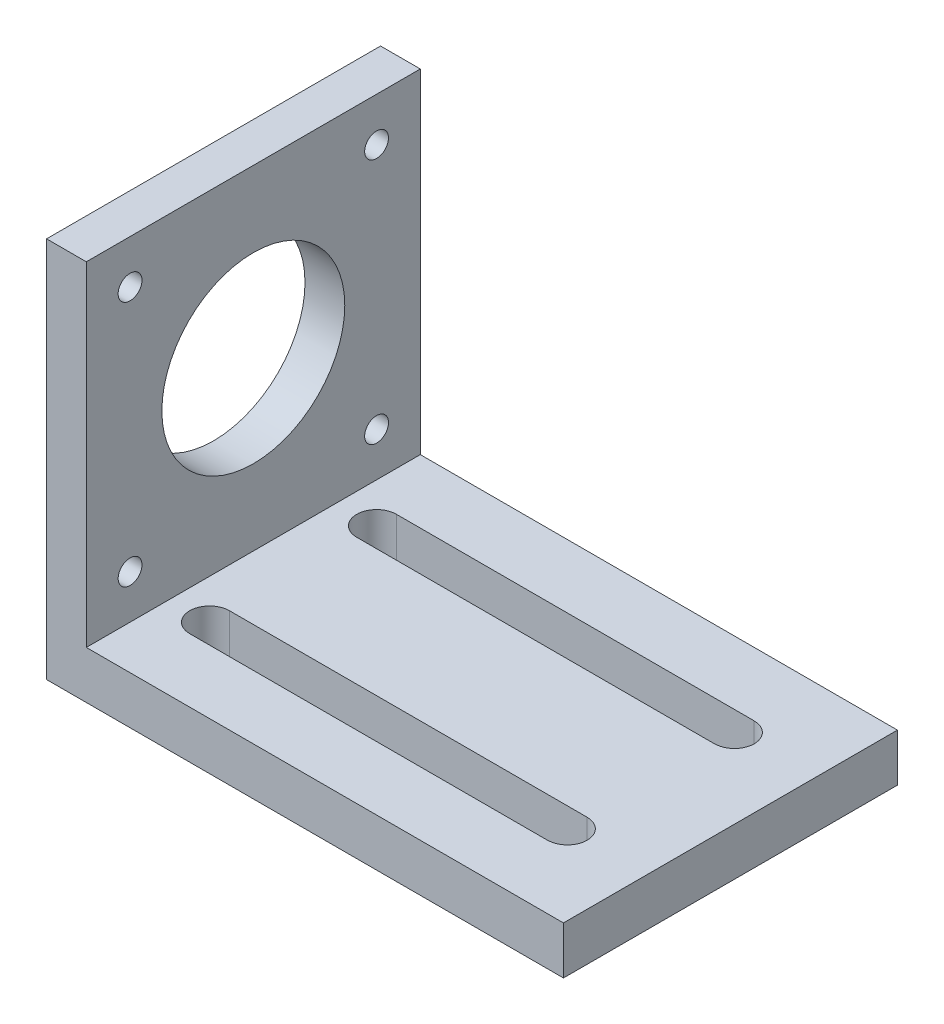
ISO-10303-21;
HEADER;
FILE_DESCRIPTION(('STEP AP214'),'2;1');
FILE_NAME('part.step','',(''),(''),'','','');
FILE_SCHEMA(('AUTOMOTIVE_DESIGN { 1 0 10303 214 1 1 1 1 }'));
ENDSEC;
DATA;
#1=APPLICATION_CONTEXT('core data for automotive mechanical design processes');
#2=APPLICATION_PROTOCOL_DEFINITION('international standard','automotive_design',2000,#1);
#3=PRODUCT_CONTEXT('',#1,'mechanical');
#4=PRODUCT('Part','Part','',(#3));
#5=PRODUCT_RELATED_PRODUCT_CATEGORY('part','',(#4));
#6=PRODUCT_DEFINITION_FORMATION('','',#4);
#7=PRODUCT_DEFINITION_CONTEXT('part definition',#1,'design');
#8=PRODUCT_DEFINITION('design','',#6,#7);
#9=PRODUCT_DEFINITION_SHAPE('','',#8);
#10=(LENGTH_UNIT() NAMED_UNIT(*) SI_UNIT(.MILLI.,.METRE.));
#11=(NAMED_UNIT(*) PLANE_ANGLE_UNIT() SI_UNIT($,.RADIAN.));
#12=(NAMED_UNIT(*) SI_UNIT($,.STERADIAN.) SOLID_ANGLE_UNIT());
#13=UNCERTAINTY_MEASURE_WITH_UNIT(LENGTH_MEASURE(1.E-05),#10,'distance_accuracy_value','');
#14=(GEOMETRIC_REPRESENTATION_CONTEXT(3) GLOBAL_UNCERTAINTY_ASSIGNED_CONTEXT((#13)) GLOBAL_UNIT_ASSIGNED_CONTEXT((#10,
#11,#12)) REPRESENTATION_CONTEXT('',''));
#15=CARTESIAN_POINT('',(0.,0.,0.));
#16=DIRECTION('',(0.,0.,1.));
#17=DIRECTION('',(1.,0.,0.));
#18=AXIS2_PLACEMENT_3D('',#15,#16,#17);
#19=CARTESIAN_POINT('',(65.,-21.,6.70926517571884));
#20=DIRECTION('',(0.,1.,0.));
#21=DIRECTION('',(0.,0.,1.));
#22=AXIS2_PLACEMENT_3D('',#19,#20,#21);
#23=PLANE('',#22);
#24=CARTESIAN_POINT('',(55.,-21.,38.2092651757188));
#25=DIRECTION('',(0.,1.,0.));
#26=DIRECTION('',(0.,0.,1.));
#27=AXIS2_PLACEMENT_3D('',#24,#25,#26);
#28=CIRCLE('',#27,2.4870696301697);
#29=CARTESIAN_POINT('',(55.,-21.,40.6963348058885));
#30=VERTEX_POINT('',#29);
#31=CARTESIAN_POINT('',(55.,-21.,35.7221955455492));
#32=VERTEX_POINT('',#31);
#33=EDGE_CURVE('E253',#30,#32,#28,.T.);
#34=ORIENTED_EDGE('',*,*,#33,.F.);
#35=DIRECTION('',(0.,0.,1.));
#36=VECTOR('',#35,1.);
#37=CARTESIAN_POINT('',(55.,-21.,6.70926517571884));
#38=LINE('',#37,#36);
#39=CARTESIAN_POINT('',(55.,-21.,40.7092651757188));
#40=VERTEX_POINT('',#39);
#41=EDGE_CURVE('E243',#30,#40,#38,.T.);
#42=ORIENTED_EDGE('',*,*,#41,.T.);
#43=DIRECTION('',(-1.,0.,0.));
#44=VECTOR('',#43,1.);
#45=CARTESIAN_POINT('',(65.,-21.,40.7092651757189));
#46=LINE('',#45,#44);
#47=CARTESIAN_POINT('',(10.,-21.,40.7092651757188));
#48=VERTEX_POINT('',#47);
#49=EDGE_CURVE('E166',#40,#48,#46,.T.);
#50=ORIENTED_EDGE('',*,*,#49,.T.);
#51=CARTESIAN_POINT('',(10.,-21.,38.2092651757188));
#52=DIRECTION('',(0.,1.,0.));
#53=DIRECTION('',(0.,0.,1.));
#54=AXIS2_PLACEMENT_3D('',#51,#52,#53);
#55=CIRCLE('',#54,2.5);
#56=CARTESIAN_POINT('',(10.,-21.,35.7092651757188));
#57=VERTEX_POINT('',#56);
#58=EDGE_CURVE('E246',#57,#48,#55,.T.);
#59=ORIENTED_EDGE('',*,*,#58,.F.);
#60=DIRECTION('',(-1.,0.,0.));
#61=VECTOR('',#60,1.);
#62=CARTESIAN_POINT('',(65.,-21.,35.7092651757189));
#63=LINE('',#62,#61);
#64=CARTESIAN_POINT('',(55.,-21.,35.7092651757189));
#65=VERTEX_POINT('',#64);
#66=EDGE_CURVE('E248',#65,#57,#63,.T.);
#67=ORIENTED_EDGE('',*,*,#66,.F.);
#68=DIRECTION('',(0.,0.,1.));
#69=VECTOR('',#68,1.);
#70=CARTESIAN_POINT('',(55.,-21.,6.70926517571884));
#71=LINE('',#70,#69);
#72=EDGE_CURVE('E250',#65,#32,#71,.T.);
#73=ORIENTED_EDGE('',*,*,#72,.T.);
#74=EDGE_LOOP('',(#34,#42,#50,#59,#67,#73));
#75=FACE_BOUND('',#74,.T.);
#76=DIRECTION('',(0.,0.,-1.));
#77=VECTOR('',#76,1.);
#78=CARTESIAN_POINT('',(5.,-21.,48.7092651757188));
#79=LINE('',#78,#77);
#80=CARTESIAN_POINT('',(5.,-21.,48.7092651757188));
#81=VERTEX_POINT('',#80);
#82=CARTESIAN_POINT('',(5.,-21.,6.70926517571884));
#83=VERTEX_POINT('',#82);
#84=EDGE_CURVE('E315',#81,#83,#79,.T.);
#85=ORIENTED_EDGE('',*,*,#84,.F.);
#86=DIRECTION('',(-1.,0.,0.));
#87=VECTOR('',#86,1.);
#88=CARTESIAN_POINT('',(65.,-21.,48.7092651757188));
#89=LINE('',#88,#87);
#90=CARTESIAN_POINT('',(65.,-21.,48.7092651757188));
#91=VERTEX_POINT('',#90);
#92=EDGE_CURVE('E274',#91,#81,#89,.T.);
#93=ORIENTED_EDGE('',*,*,#92,.F.);
#94=DIRECTION('',(0.,0.,-1.));
#95=VECTOR('',#94,1.);
#96=CARTESIAN_POINT('',(65.,-21.,6.70926517571884));
#97=LINE('',#96,#95);
#98=CARTESIAN_POINT('',(65.,-21.,6.70926517571884));
#99=VERTEX_POINT('',#98);
#100=EDGE_CURVE('E265',#91,#99,#97,.T.);
#101=ORIENTED_EDGE('',*,*,#100,.T.);
#102=DIRECTION('',(-1.,0.,0.));
#103=VECTOR('',#102,1.);
#104=CARTESIAN_POINT('',(65.,-21.,6.70926517571884));
#105=LINE('',#104,#103);
#106=EDGE_CURVE('E271',#99,#83,#105,.T.);
#107=ORIENTED_EDGE('',*,*,#106,.T.);
#108=EDGE_LOOP('',(#85,#93,#101,#107));
#109=FACE_BOUND('',#108,.T.);
#110=DIRECTION('',(-1.,0.,0.));
#111=VECTOR('',#110,1.);
#112=CARTESIAN_POINT('',(65.,-21.,19.7092651757188));
#113=LINE('',#112,#111);
#114=CARTESIAN_POINT('',(55.,-21.,19.7092651757188));
#115=VERTEX_POINT('',#114);
#116=CARTESIAN_POINT('',(10.,-21.,19.7092651757188));
#117=VERTEX_POINT('',#116);
#118=EDGE_CURVE('E237',#115,#117,#113,.T.);
#119=ORIENTED_EDGE('',*,*,#118,.T.);
#120=CARTESIAN_POINT('',(10.,-21.,17.2092651757188));
#121=DIRECTION('',(0.,1.,0.));
#122=DIRECTION('',(0.,0.,1.));
#123=AXIS2_PLACEMENT_3D('',#120,#121,#122);
#124=CIRCLE('',#123,2.5);
#125=CARTESIAN_POINT('',(10.,-21.,14.7092651757188));
#126=VERTEX_POINT('',#125);
#127=EDGE_CURVE('E240',#117,#126,#124,.F.);
#128=ORIENTED_EDGE('',*,*,#127,.T.);
#129=DIRECTION('',(-1.,0.,0.));
#130=VECTOR('',#129,1.);
#131=CARTESIAN_POINT('',(65.,-21.,14.7092651757188));
#132=LINE('',#131,#130);
#133=CARTESIAN_POINT('',(55.,-21.,14.7092651757188));
#134=VERTEX_POINT('',#133);
#135=EDGE_CURVE('E195',#134,#126,#132,.T.);
#136=ORIENTED_EDGE('',*,*,#135,.F.);
#137=DIRECTION('',(0.,0.,-1.));
#138=VECTOR('',#137,1.);
#139=CARTESIAN_POINT('',(55.,-21.,6.70926517571884));
#140=LINE('',#139,#138);
#141=CARTESIAN_POINT('',(55.,-21.,14.7221955455491));
#142=VERTEX_POINT('',#141);
#143=EDGE_CURVE('E230',#142,#134,#140,.T.);
#144=ORIENTED_EDGE('',*,*,#143,.F.);
#145=CARTESIAN_POINT('',(55.,-21.,17.2092651757188));
#146=DIRECTION('',(0.,1.,0.));
#147=DIRECTION('',(0.,0.,1.));
#148=AXIS2_PLACEMENT_3D('',#145,#146,#147);
#149=CIRCLE('',#148,2.4870696301697);
#150=CARTESIAN_POINT('',(55.,-21.,19.6963348058885));
#151=VERTEX_POINT('',#150);
#152=EDGE_CURVE('E232',#142,#151,#149,.F.);
#153=ORIENTED_EDGE('',*,*,#152,.T.);
#154=DIRECTION('',(0.,0.,-1.));
#155=VECTOR('',#154,1.);
#156=CARTESIAN_POINT('',(55.,-21.,6.70926517571884));
#157=LINE('',#156,#155);
#158=EDGE_CURVE('E235',#115,#151,#157,.T.);
#159=ORIENTED_EDGE('',*,*,#158,.F.);
#160=EDGE_LOOP('',(#119,#128,#136,#144,#153,#159));
#161=FACE_BOUND('',#160,.T.);
#162=ADVANCED_FACE('F35',(#75,#109,#161),#23,.T.);
#163=CARTESIAN_POINT('',(65.,-27.,6.70926517571884));
#164=DIRECTION('',(0.,-1.,0.));
#165=DIRECTION('',(0.,0.,-1.));
#166=AXIS2_PLACEMENT_3D('',#163,#164,#165);
#167=PLANE('',#166);
#168=CARTESIAN_POINT('',(55.,-27.,38.2092651757188));
#169=DIRECTION('',(0.,-1.,0.));
#170=DIRECTION('',(0.,0.,-1.));
#171=AXIS2_PLACEMENT_3D('',#168,#169,#170);
#172=CIRCLE('',#171,2.4870696301697);
#173=CARTESIAN_POINT('',(55.,-27.,35.7221955455492));
#174=VERTEX_POINT('',#173);
#175=CARTESIAN_POINT('',(55.,-27.,40.6963348058885));
#176=VERTEX_POINT('',#175);
#177=EDGE_CURVE('E178',#174,#176,#172,.T.);
#178=ORIENTED_EDGE('',*,*,#177,.F.);
#179=DIRECTION('',(0.,0.,-1.));
#180=VECTOR('',#179,1.);
#181=CARTESIAN_POINT('',(55.,-27.,0.));
#182=LINE('',#181,#180);
#183=CARTESIAN_POINT('',(55.,-27.,35.7092651757189));
#184=VERTEX_POINT('',#183);
#185=EDGE_CURVE('E180',#174,#184,#182,.T.);
#186=ORIENTED_EDGE('',*,*,#185,.T.);
#187=DIRECTION('',(1.,0.,0.));
#188=VECTOR('',#187,1.);
#189=CARTESIAN_POINT('',(0.,-27.,35.7092651757188));
#190=LINE('',#189,#188);
#191=CARTESIAN_POINT('',(10.,-27.,35.7092651757188));
#192=VERTEX_POINT('',#191);
#193=EDGE_CURVE('E187',#192,#184,#190,.T.);
#194=ORIENTED_EDGE('',*,*,#193,.F.);
#195=CARTESIAN_POINT('',(10.,-27.,38.2092651757188));
#196=DIRECTION('',(0.,-1.,0.));
#197=DIRECTION('',(0.,0.,-1.));
#198=AXIS2_PLACEMENT_3D('',#195,#196,#197);
#199=CIRCLE('',#198,2.5);
#200=CARTESIAN_POINT('',(10.,-27.,40.7092651757188));
#201=VERTEX_POINT('',#200);
#202=EDGE_CURVE('E185',#201,#192,#199,.T.);
#203=ORIENTED_EDGE('',*,*,#202,.F.);
#204=DIRECTION('',(1.,0.,0.));
#205=VECTOR('',#204,1.);
#206=CARTESIAN_POINT('',(0.,-27.,40.7092651757188));
#207=LINE('',#206,#205);
#208=CARTESIAN_POINT('',(55.,-27.,40.7092651757188));
#209=VERTEX_POINT('',#208);
#210=EDGE_CURVE('E163',#201,#209,#207,.T.);
#211=ORIENTED_EDGE('',*,*,#210,.T.);
#212=EDGE_CURVE('E173',#209,#176,#182,.T.);
#213=ORIENTED_EDGE('',*,*,#212,.T.);
#214=EDGE_LOOP('',(#178,#186,#194,#203,#211,#213));
#215=FACE_BOUND('',#214,.T.);
#216=DIRECTION('',(0.,0.,1.));
#217=VECTOR('',#216,1.);
#218=CARTESIAN_POINT('',(0.,-27.,6.70926517571884));
#219=LINE('',#218,#217);
#220=CARTESIAN_POINT('',(0.,-27.,6.70926517571884));
#221=VERTEX_POINT('',#220);
#222=CARTESIAN_POINT('',(0.,-27.,48.7092651757188));
#223=VERTEX_POINT('',#222);
#224=EDGE_CURVE('E255',#221,#223,#219,.T.);
#225=ORIENTED_EDGE('',*,*,#224,.F.);
#226=DIRECTION('',(-1.,0.,0.));
#227=VECTOR('',#226,1.);
#228=CARTESIAN_POINT('',(65.,-27.,6.70926517571884));
#229=LINE('',#228,#227);
#230=CARTESIAN_POINT('',(65.,-27.,6.70926517571884));
#231=VERTEX_POINT('',#230);
#232=EDGE_CURVE('E268',#231,#221,#229,.T.);
#233=ORIENTED_EDGE('',*,*,#232,.F.);
#234=DIRECTION('',(0.,0.,1.));
#235=VECTOR('',#234,1.);
#236=CARTESIAN_POINT('',(65.,-27.,6.70926517571884));
#237=LINE('',#236,#235);
#238=CARTESIAN_POINT('',(65.,-27.,48.7092651757188));
#239=VERTEX_POINT('',#238);
#240=EDGE_CURVE('E259',#231,#239,#237,.T.);
#241=ORIENTED_EDGE('',*,*,#240,.T.);
#242=DIRECTION('',(-1.,0.,0.));
#243=VECTOR('',#242,1.);
#244=CARTESIAN_POINT('',(65.,-27.,48.7092651757188));
#245=LINE('',#244,#243);
#246=EDGE_CURVE('E277',#239,#223,#245,.T.);
#247=ORIENTED_EDGE('',*,*,#246,.T.);
#248=EDGE_LOOP('',(#225,#233,#241,#247));
#249=FACE_BOUND('',#248,.T.);
#250=DIRECTION('',(1.,0.,0.));
#251=VECTOR('',#250,1.);
#252=CARTESIAN_POINT('',(0.,-27.,14.7092651757189));
#253=LINE('',#252,#251);
#254=CARTESIAN_POINT('',(10.,-27.,14.7092651757188));
#255=VERTEX_POINT('',#254);
#256=CARTESIAN_POINT('',(55.,-27.,14.7092651757188));
#257=VERTEX_POINT('',#256);
#258=EDGE_CURVE('E205',#255,#257,#253,.T.);
#259=ORIENTED_EDGE('',*,*,#258,.F.);
#260=CARTESIAN_POINT('',(10.,-27.,17.2092651757188));
#261=DIRECTION('',(0.,-1.,0.));
#262=DIRECTION('',(0.,0.,-1.));
#263=AXIS2_PLACEMENT_3D('',#260,#261,#262);
#264=CIRCLE('',#263,2.5);
#265=CARTESIAN_POINT('',(10.,-27.,19.7092651757188));
#266=VERTEX_POINT('',#265);
#267=EDGE_CURVE('E202',#255,#266,#264,.F.);
#268=ORIENTED_EDGE('',*,*,#267,.T.);
#269=DIRECTION('',(1.,0.,0.));
#270=VECTOR('',#269,1.);
#271=CARTESIAN_POINT('',(0.,-27.,19.7092651757188));
#272=LINE('',#271,#270);
#273=CARTESIAN_POINT('',(55.,-27.,19.7092651757188));
#274=VERTEX_POINT('',#273);
#275=EDGE_CURVE('E214',#266,#274,#272,.T.);
#276=ORIENTED_EDGE('',*,*,#275,.T.);
#277=DIRECTION('',(0.,0.,1.));
#278=VECTOR('',#277,1.);
#279=CARTESIAN_POINT('',(55.,-27.,0.));
#280=LINE('',#279,#278);
#281=CARTESIAN_POINT('',(55.,-27.,19.6963348058885));
#282=VERTEX_POINT('',#281);
#283=EDGE_CURVE('E211',#282,#274,#280,.T.);
#284=ORIENTED_EDGE('',*,*,#283,.F.);
#285=CARTESIAN_POINT('',(55.,-27.,17.2092651757188));
#286=DIRECTION('',(0.,-1.,0.));
#287=DIRECTION('',(0.,0.,-1.));
#288=AXIS2_PLACEMENT_3D('',#285,#286,#287);
#289=CIRCLE('',#288,2.4870696301697);
#290=CARTESIAN_POINT('',(55.,-27.,14.7221955455491));
#291=VERTEX_POINT('',#290);
#292=EDGE_CURVE('E210',#282,#291,#289,.F.);
#293=ORIENTED_EDGE('',*,*,#292,.T.);
#294=EDGE_CURVE('E207',#257,#291,#280,.T.);
#295=ORIENTED_EDGE('',*,*,#294,.F.);
#296=EDGE_LOOP('',(#259,#268,#276,#284,#293,#295));
#297=FACE_BOUND('',#296,.T.);
#298=ADVANCED_FACE('F181',(#215,#249,#297),#167,.T.);
#299=CARTESIAN_POINT('',(5.,0.,0.));
#300=DIRECTION('',(1.,0.,0.));
#301=DIRECTION('',(0.,0.,-1.));
#302=AXIS2_PLACEMENT_3D('',#299,#300,#301);
#303=PLANE('',#302);
#304=CARTESIAN_POINT('',(5.,0.,27.7092651757188));
#305=DIRECTION('',(1.,0.,0.));
#306=DIRECTION('',(0.,0.,-1.));
#307=AXIS2_PLACEMENT_3D('',#304,#305,#306);
#308=CIRCLE('',#307,11.5);
#309=CARTESIAN_POINT('',(5.,0.,16.2092651757188));
#310=VERTEX_POINT('',#309);
#311=EDGE_CURVE('E591',#310,#310,#308,.T.);
#312=ORIENTED_EDGE('',*,*,#311,.F.);
#313=EDGE_LOOP('',(#312));
#314=FACE_BOUND('',#313,.T.);
#315=CARTESIAN_POINT('',(5.,-15.5,12.2092651757188));
#316=DIRECTION('',(1.,0.,0.));
#317=DIRECTION('',(0.,0.,-1.));
#318=AXIS2_PLACEMENT_3D('',#315,#316,#317);
#319=CIRCLE('',#318,1.5);
#320=CARTESIAN_POINT('',(5.,-15.5,10.7092651757188));
#321=VERTEX_POINT('',#320);
#322=EDGE_CURVE('E288',#321,#321,#319,.T.);
#323=ORIENTED_EDGE('',*,*,#322,.F.);
#324=EDGE_LOOP('',(#323));
#325=FACE_BOUND('',#324,.T.);
#326=CARTESIAN_POINT('',(5.,15.5,12.2092651757188));
#327=DIRECTION('',(1.,0.,0.));
#328=DIRECTION('',(0.,0.,-1.));
#329=AXIS2_PLACEMENT_3D('',#326,#327,#328);
#330=CIRCLE('',#329,1.5);
#331=CARTESIAN_POINT('',(5.,15.5,10.7092651757188));
#332=VERTEX_POINT('',#331);
#333=EDGE_CURVE('E300',#332,#332,#330,.T.);
#334=ORIENTED_EDGE('',*,*,#333,.F.);
#335=EDGE_LOOP('',(#334));
#336=FACE_BOUND('',#335,.T.);
#337=DIRECTION('',(0.,1.,0.));
#338=VECTOR('',#337,1.);
#339=CARTESIAN_POINT('',(5.,21.,6.70926517571884));
#340=LINE('',#339,#338);
#341=CARTESIAN_POINT('',(5.,21.,6.70926517571884));
#342=VERTEX_POINT('',#341);
#343=EDGE_CURVE('E306',#83,#342,#340,.T.);
#344=ORIENTED_EDGE('',*,*,#343,.T.);
#345=DIRECTION('',(0.,0.,1.));
#346=VECTOR('',#345,1.);
#347=CARTESIAN_POINT('',(5.,21.,48.7092651757188));
#348=LINE('',#347,#346);
#349=CARTESIAN_POINT('',(5.,21.,48.7092651757188));
#350=VERTEX_POINT('',#349);
#351=EDGE_CURVE('E309',#342,#350,#348,.T.);
#352=ORIENTED_EDGE('',*,*,#351,.T.);
#353=DIRECTION('',(0.,-1.,0.));
#354=VECTOR('',#353,1.);
#355=CARTESIAN_POINT('',(5.,21.,48.7092651757188));
#356=LINE('',#355,#354);
#357=EDGE_CURVE('E312',#350,#81,#356,.T.);
#358=ORIENTED_EDGE('',*,*,#357,.T.);
#359=ORIENTED_EDGE('',*,*,#84,.T.);
#360=EDGE_LOOP('',(#344,#352,#358,#359));
#361=FACE_BOUND('',#360,.T.);
#362=CARTESIAN_POINT('',(5.,15.5,43.2092651757188));
#363=DIRECTION('',(1.,0.,0.));
#364=DIRECTION('',(0.,0.,-1.));
#365=AXIS2_PLACEMENT_3D('',#362,#363,#364);
#366=CIRCLE('',#365,1.5);
#367=CARTESIAN_POINT('',(5.,15.5,41.7092651757188));
#368=VERTEX_POINT('',#367);
#369=EDGE_CURVE('E294',#368,#368,#366,.T.);
#370=ORIENTED_EDGE('',*,*,#369,.F.);
#371=EDGE_LOOP('',(#370));
#372=FACE_BOUND('',#371,.T.);
#373=CARTESIAN_POINT('',(5.,-15.5,43.2092651757188));
#374=DIRECTION('',(1.,0.,0.));
#375=DIRECTION('',(0.,0.,-1.));
#376=AXIS2_PLACEMENT_3D('',#373,#374,#375);
#377=CIRCLE('',#376,1.5);
#378=CARTESIAN_POINT('',(5.,-15.5,41.7092651757188));
#379=VERTEX_POINT('',#378);
#380=EDGE_CURVE('E282',#379,#379,#377,.T.);
#381=ORIENTED_EDGE('',*,*,#380,.F.);
#382=EDGE_LOOP('',(#381));
#383=FACE_BOUND('',#382,.T.);
#384=ADVANCED_FACE('F344',(#314,#325,#336,#361,#372,#383),#303,.T.);
#385=CARTESIAN_POINT('',(0.,0.,0.));
#386=DIRECTION('',(1.,0.,0.));
#387=DIRECTION('',(0.,0.,-1.));
#388=AXIS2_PLACEMENT_3D('',#385,#386,#387);
#389=PLANE('',#388);
#390=CARTESIAN_POINT('',(0.,0.,27.7092651757188));
#391=DIRECTION('',(1.,0.,0.));
#392=DIRECTION('',(0.,0.,-1.));
#393=AXIS2_PLACEMENT_3D('',#390,#391,#392);
#394=CIRCLE('',#393,11.5);
#395=CARTESIAN_POINT('',(0.,0.,16.2092651757188));
#396=VERTEX_POINT('',#395);
#397=EDGE_CURVE('E39',#396,#396,#394,.T.);
#398=ORIENTED_EDGE('',*,*,#397,.T.);
#399=EDGE_LOOP('',(#398));
#400=FACE_BOUND('',#399,.T.);
#401=DIRECTION('',(0.,1.,0.));
#402=VECTOR('',#401,1.);
#403=CARTESIAN_POINT('',(0.,21.,6.70926517571884));
#404=LINE('',#403,#402);
#405=CARTESIAN_POINT('',(0.,21.,6.70926517571884));
#406=VERTEX_POINT('',#405);
#407=EDGE_CURVE('E303',#221,#406,#404,.T.);
#408=ORIENTED_EDGE('',*,*,#407,.F.);
#409=ORIENTED_EDGE('',*,*,#224,.T.);
#410=DIRECTION('',(0.,-1.,0.));
#411=VECTOR('',#410,1.);
#412=CARTESIAN_POINT('',(0.,21.,48.7092651757188));
#413=LINE('',#412,#411);
#414=CARTESIAN_POINT('',(0.,21.,48.7092651757188));
#415=VERTEX_POINT('',#414);
#416=EDGE_CURVE('E310',#415,#223,#413,.T.);
#417=ORIENTED_EDGE('',*,*,#416,.F.);
#418=DIRECTION('',(0.,0.,1.));
#419=VECTOR('',#418,1.);
#420=CARTESIAN_POINT('',(0.,21.,48.7092651757188));
#421=LINE('',#420,#419);
#422=EDGE_CURVE('E320',#406,#415,#421,.T.);
#423=ORIENTED_EDGE('',*,*,#422,.F.);
#424=EDGE_LOOP('',(#408,#409,#417,#423));
#425=FACE_BOUND('',#424,.T.);
#426=CARTESIAN_POINT('',(0.,15.5,12.2092651757188));
#427=DIRECTION('',(1.,0.,0.));
#428=DIRECTION('',(0.,0.,-1.));
#429=AXIS2_PLACEMENT_3D('',#426,#427,#428);
#430=CIRCLE('',#429,1.5);
#431=CARTESIAN_POINT('',(0.,15.5,10.7092651757188));
#432=VERTEX_POINT('',#431);
#433=EDGE_CURVE('E297',#432,#432,#430,.T.);
#434=ORIENTED_EDGE('',*,*,#433,.T.);
#435=EDGE_LOOP('',(#434));
#436=FACE_BOUND('',#435,.T.);
#437=CARTESIAN_POINT('',(0.,15.5,43.2092651757188));
#438=DIRECTION('',(1.,0.,0.));
#439=DIRECTION('',(0.,0.,-1.));
#440=AXIS2_PLACEMENT_3D('',#437,#438,#439);
#441=CIRCLE('',#440,1.5);
#442=CARTESIAN_POINT('',(0.,15.5,41.7092651757188));
#443=VERTEX_POINT('',#442);
#444=EDGE_CURVE('E291',#443,#443,#441,.T.);
#445=ORIENTED_EDGE('',*,*,#444,.T.);
#446=EDGE_LOOP('',(#445));
#447=FACE_BOUND('',#446,.T.);
#448=CARTESIAN_POINT('',(0.,-15.5,12.2092651757188));
#449=DIRECTION('',(1.,0.,0.));
#450=DIRECTION('',(0.,0.,-1.));
#451=AXIS2_PLACEMENT_3D('',#448,#449,#450);
#452=CIRCLE('',#451,1.5);
#453=CARTESIAN_POINT('',(0.,-15.5,10.7092651757188));
#454=VERTEX_POINT('',#453);
#455=EDGE_CURVE('E285',#454,#454,#452,.T.);
#456=ORIENTED_EDGE('',*,*,#455,.T.);
#457=EDGE_LOOP('',(#456));
#458=FACE_BOUND('',#457,.T.);
#459=CARTESIAN_POINT('',(0.,-15.5,43.2092651757188));
#460=DIRECTION('',(1.,0.,0.));
#461=DIRECTION('',(0.,0.,-1.));
#462=AXIS2_PLACEMENT_3D('',#459,#460,#461);
#463=CIRCLE('',#462,1.5);
#464=CARTESIAN_POINT('',(0.,-15.5,41.7092651757188));
#465=VERTEX_POINT('',#464);
#466=EDGE_CURVE('E273',#465,#465,#463,.T.);
#467=ORIENTED_EDGE('',*,*,#466,.T.);
#468=EDGE_LOOP('',(#467));
#469=FACE_BOUND('',#468,.T.);
#470=ADVANCED_FACE('F331',(#400,#425,#436,#447,#458,#469),#389,.F.);
#471=CARTESIAN_POINT('',(5.,21.,6.70926517571884));
#472=DIRECTION('',(0.,0.,1.));
#473=DIRECTION('',(1.,0.,0.));
#474=AXIS2_PLACEMENT_3D('',#471,#472,#473);
#475=PLANE('',#474);
#476=ORIENTED_EDGE('',*,*,#407,.T.);
#477=DIRECTION('',(-1.,0.,0.));
#478=VECTOR('',#477,1.);
#479=CARTESIAN_POINT('',(5.,21.,6.70926517571884));
#480=LINE('',#479,#478);
#481=EDGE_CURVE('E11',#342,#406,#480,.T.);
#482=ORIENTED_EDGE('',*,*,#481,.F.);
#483=ORIENTED_EDGE('',*,*,#343,.F.);
#484=ORIENTED_EDGE('',*,*,#106,.F.);
#485=DIRECTION('',(0.,-1.,0.));
#486=VECTOR('',#485,1.);
#487=CARTESIAN_POINT('',(65.,-21.,6.70926517571884));
#488=LINE('',#487,#486);
#489=EDGE_CURVE('E256',#99,#231,#488,.T.);
#490=ORIENTED_EDGE('',*,*,#489,.T.);
#491=ORIENTED_EDGE('',*,*,#232,.T.);
#492=EDGE_LOOP('',(#476,#482,#483,#484,#490,#491));
#493=FACE_BOUND('',#492,.T.);
#494=ADVANCED_FACE('F37',(#493),#475,.F.);
#495=CARTESIAN_POINT('',(5.,21.,48.7092651757188));
#496=DIRECTION('',(0.,-1.,0.));
#497=DIRECTION('',(0.,0.,-1.));
#498=AXIS2_PLACEMENT_3D('',#495,#496,#497);
#499=PLANE('',#498);
#500=ORIENTED_EDGE('',*,*,#422,.T.);
#501=DIRECTION('',(-1.,0.,0.));
#502=VECTOR('',#501,1.);
#503=CARTESIAN_POINT('',(5.,21.,48.7092651757188));
#504=LINE('',#503,#502);
#505=EDGE_CURVE('E44',#350,#415,#504,.T.);
#506=ORIENTED_EDGE('',*,*,#505,.F.);
#507=ORIENTED_EDGE('',*,*,#351,.F.);
#508=ORIENTED_EDGE('',*,*,#481,.T.);
#509=EDGE_LOOP('',(#500,#506,#507,#508));
#510=FACE_BOUND('',#509,.T.);
#511=ADVANCED_FACE('F348',(#510),#499,.F.);
#512=CARTESIAN_POINT('',(5.,21.,48.7092651757188));
#513=DIRECTION('',(0.,0.,-1.));
#514=DIRECTION('',(-1.,0.,0.));
#515=AXIS2_PLACEMENT_3D('',#512,#513,#514);
#516=PLANE('',#515);
#517=ORIENTED_EDGE('',*,*,#416,.T.);
#518=ORIENTED_EDGE('',*,*,#246,.F.);
#519=DIRECTION('',(0.,1.,0.));
#520=VECTOR('',#519,1.);
#521=CARTESIAN_POINT('',(65.,-21.,48.7092651757188));
#522=LINE('',#521,#520);
#523=EDGE_CURVE('E262',#239,#91,#522,.T.);
#524=ORIENTED_EDGE('',*,*,#523,.T.);
#525=ORIENTED_EDGE('',*,*,#92,.T.);
#526=ORIENTED_EDGE('',*,*,#357,.F.);
#527=ORIENTED_EDGE('',*,*,#505,.T.);
#528=EDGE_LOOP('',(#517,#518,#524,#525,#526,#527));
#529=FACE_BOUND('',#528,.T.);
#530=ADVANCED_FACE('F328',(#529),#516,.F.);
#531=CARTESIAN_POINT('',(5.,15.5,12.2092651757188));
#532=DIRECTION('',(-1.,0.,0.));
#533=DIRECTION('',(0.,0.,1.));
#534=AXIS2_PLACEMENT_3D('',#531,#532,#533);
#535=CYLINDRICAL_SURFACE('',#534,1.5);
#536=ORIENTED_EDGE('',*,*,#333,.T.);
#537=EDGE_LOOP('',(#536));
#538=FACE_BOUND('',#537,.T.);
#539=ORIENTED_EDGE('',*,*,#433,.F.);
#540=EDGE_LOOP('',(#539));
#541=FACE_BOUND('',#540,.T.);
#542=ADVANCED_FACE('F379',(#538,#541),#535,.F.);
#543=CARTESIAN_POINT('',(5.,15.5,43.2092651757188));
#544=DIRECTION('',(-1.,0.,0.));
#545=DIRECTION('',(0.,0.,1.));
#546=AXIS2_PLACEMENT_3D('',#543,#544,#545);
#547=CYLINDRICAL_SURFACE('',#546,1.5);
#548=ORIENTED_EDGE('',*,*,#369,.T.);
#549=EDGE_LOOP('',(#548));
#550=FACE_BOUND('',#549,.T.);
#551=ORIENTED_EDGE('',*,*,#444,.F.);
#552=EDGE_LOOP('',(#551));
#553=FACE_BOUND('',#552,.T.);
#554=ADVANCED_FACE('F375',(#550,#553),#547,.F.);
#555=CARTESIAN_POINT('',(5.,-15.5,12.2092651757188));
#556=DIRECTION('',(-1.,0.,0.));
#557=DIRECTION('',(0.,0.,1.));
#558=AXIS2_PLACEMENT_3D('',#555,#556,#557);
#559=CYLINDRICAL_SURFACE('',#558,1.5);
#560=ORIENTED_EDGE('',*,*,#322,.T.);
#561=EDGE_LOOP('',(#560));
#562=FACE_BOUND('',#561,.T.);
#563=ORIENTED_EDGE('',*,*,#455,.F.);
#564=EDGE_LOOP('',(#563));
#565=FACE_BOUND('',#564,.T.);
#566=ADVANCED_FACE('F371',(#562,#565),#559,.F.);
#567=CARTESIAN_POINT('',(5.,-15.5,43.2092651757188));
#568=DIRECTION('',(-1.,0.,0.));
#569=DIRECTION('',(0.,0.,1.));
#570=AXIS2_PLACEMENT_3D('',#567,#568,#569);
#571=CYLINDRICAL_SURFACE('',#570,1.5);
#572=ORIENTED_EDGE('',*,*,#380,.T.);
#573=EDGE_LOOP('',(#572));
#574=FACE_BOUND('',#573,.T.);
#575=ORIENTED_EDGE('',*,*,#466,.F.);
#576=EDGE_LOOP('',(#575));
#577=FACE_BOUND('',#576,.T.);
#578=ADVANCED_FACE('F368',(#574,#577),#571,.F.);
#579=CARTESIAN_POINT('',(65.,0.,0.));
#580=DIRECTION('',(-1.,0.,0.));
#581=DIRECTION('',(0.,0.,1.));
#582=AXIS2_PLACEMENT_3D('',#579,#580,#581);
#583=PLANE('',#582);
#584=ORIENTED_EDGE('',*,*,#489,.F.);
#585=ORIENTED_EDGE('',*,*,#100,.F.);
#586=ORIENTED_EDGE('',*,*,#523,.F.);
#587=ORIENTED_EDGE('',*,*,#240,.F.);
#588=EDGE_LOOP('',(#584,#585,#586,#587));
#589=FACE_BOUND('',#588,.T.);
#590=ADVANCED_FACE('F340',(#589),#583,.F.);
#591=CARTESIAN_POINT('',(10.,38.,17.2092651757188));
#592=DIRECTION('',(0.,-1.,0.));
#593=DIRECTION('',(0.,0.,-1.));
#594=AXIS2_PLACEMENT_3D('',#591,#592,#593);
#595=CYLINDRICAL_SURFACE('',#594,2.5);
#596=DIRECTION('',(0.,-1.,0.));
#597=VECTOR('',#596,1.);
#598=CARTESIAN_POINT('',(10.,38.,19.7092651757188));
#599=LINE('',#598,#597);
#600=EDGE_CURVE('E218',#117,#266,#599,.T.);
#601=ORIENTED_EDGE('',*,*,#600,.T.);
#602=ORIENTED_EDGE('',*,*,#267,.F.);
#603=DIRECTION('',(0.,-1.,0.));
#604=VECTOR('',#603,1.);
#605=CARTESIAN_POINT('',(10.,38.,14.7092651757188));
#606=LINE('',#605,#604);
#607=EDGE_CURVE('E217',#126,#255,#606,.T.);
#608=ORIENTED_EDGE('',*,*,#607,.F.);
#609=ORIENTED_EDGE('',*,*,#127,.F.);
#610=EDGE_LOOP('',(#601,#602,#608,#609));
#611=FACE_BOUND('',#610,.T.);
#612=ADVANCED_FACE('F414',(#611),#595,.F.);
#613=CARTESIAN_POINT('',(0.,38.,19.7092651757188));
#614=DIRECTION('',(0.,0.,-1.));
#615=DIRECTION('',(-1.,0.,0.));
#616=AXIS2_PLACEMENT_3D('',#613,#614,#615);
#617=PLANE('',#616);
#618=DIRECTION('',(0.,-1.,0.));
#619=VECTOR('',#618,1.);
#620=CARTESIAN_POINT('',(55.,38.,19.7092651757188));
#621=LINE('',#620,#619);
#622=EDGE_CURVE('E220',#115,#274,#621,.T.);
#623=ORIENTED_EDGE('',*,*,#622,.T.);
#624=ORIENTED_EDGE('',*,*,#275,.F.);
#625=ORIENTED_EDGE('',*,*,#600,.F.);
#626=ORIENTED_EDGE('',*,*,#118,.F.);
#627=EDGE_LOOP('',(#623,#624,#625,#626));
#628=FACE_BOUND('',#627,.T.);
#629=ADVANCED_FACE('F420',(#628),#617,.T.);
#630=CARTESIAN_POINT('',(55.,38.,0.));
#631=DIRECTION('',(1.,0.,0.));
#632=DIRECTION('',(0.,0.,-1.));
#633=AXIS2_PLACEMENT_3D('',#630,#631,#632);
#634=PLANE('',#633);
#635=ORIENTED_EDGE('',*,*,#158,.T.);
#636=DIRECTION('',(0.,-1.,0.));
#637=VECTOR('',#636,1.);
#638=CARTESIAN_POINT('',(55.,38.,19.6963348058885));
#639=LINE('',#638,#637);
#640=EDGE_CURVE('E222',#151,#282,#639,.T.);
#641=ORIENTED_EDGE('',*,*,#640,.T.);
#642=ORIENTED_EDGE('',*,*,#283,.T.);
#643=ORIENTED_EDGE('',*,*,#622,.F.);
#644=EDGE_LOOP('',(#635,#641,#642,#643));
#645=FACE_BOUND('',#644,.T.);
#646=ADVANCED_FACE('F428',(#645),#634,.F.);
#647=CARTESIAN_POINT('',(55.,38.,17.2092651757188));
#648=DIRECTION('',(0.,-1.,0.));
#649=DIRECTION('',(0.,0.,-1.));
#650=AXIS2_PLACEMENT_3D('',#647,#648,#649);
#651=CYLINDRICAL_SURFACE('',#650,2.4870696301697);
#652=DIRECTION('',(0.,-1.,0.));
#653=VECTOR('',#652,1.);
#654=CARTESIAN_POINT('',(55.,38.,14.7221955455491));
#655=LINE('',#654,#653);
#656=EDGE_CURVE('E224',#142,#291,#655,.T.);
#657=ORIENTED_EDGE('',*,*,#656,.T.);
#658=ORIENTED_EDGE('',*,*,#292,.F.);
#659=ORIENTED_EDGE('',*,*,#640,.F.);
#660=ORIENTED_EDGE('',*,*,#152,.F.);
#661=EDGE_LOOP('',(#657,#658,#659,#660));
#662=FACE_BOUND('',#661,.T.);
#663=ADVANCED_FACE('F436',(#662),#651,.F.);
#664=ORIENTED_EDGE('',*,*,#143,.T.);
#665=DIRECTION('',(0.,-1.,0.));
#666=VECTOR('',#665,1.);
#667=CARTESIAN_POINT('',(55.,38.,14.7092651757188));
#668=LINE('',#667,#666);
#669=EDGE_CURVE('E59',#134,#257,#668,.T.);
#670=ORIENTED_EDGE('',*,*,#669,.T.);
#671=ORIENTED_EDGE('',*,*,#294,.T.);
#672=ORIENTED_EDGE('',*,*,#656,.F.);
#673=EDGE_LOOP('',(#664,#670,#671,#672));
#674=FACE_BOUND('',#673,.T.);
#675=ADVANCED_FACE('F439',(#674),#634,.F.);
#676=CARTESIAN_POINT('',(0.,38.,14.7092651757189));
#677=DIRECTION('',(0.,0.,-1.));
#678=DIRECTION('',(-1.,0.,0.));
#679=AXIS2_PLACEMENT_3D('',#676,#677,#678);
#680=PLANE('',#679);
#681=ORIENTED_EDGE('',*,*,#135,.T.);
#682=ORIENTED_EDGE('',*,*,#607,.T.);
#683=ORIENTED_EDGE('',*,*,#258,.T.);
#684=ORIENTED_EDGE('',*,*,#669,.F.);
#685=EDGE_LOOP('',(#681,#682,#683,#684));
#686=FACE_BOUND('',#685,.T.);
#687=ADVANCED_FACE('F452',(#686),#680,.F.);
#688=CARTESIAN_POINT('',(55.,38.,38.2092651757188));
#689=DIRECTION('',(0.,-1.,0.));
#690=DIRECTION('',(0.,0.,-1.));
#691=AXIS2_PLACEMENT_3D('',#688,#689,#690);
#692=CYLINDRICAL_SURFACE('',#691,2.4870696301697);
#693=ORIENTED_EDGE('',*,*,#33,.T.);
#694=DIRECTION('',(0.,-1.,0.));
#695=VECTOR('',#694,1.);
#696=CARTESIAN_POINT('',(55.,38.,35.7221955455492));
#697=LINE('',#696,#695);
#698=EDGE_CURVE('E193',#32,#174,#697,.T.);
#699=ORIENTED_EDGE('',*,*,#698,.T.);
#700=ORIENTED_EDGE('',*,*,#177,.T.);
#701=DIRECTION('',(0.,-1.,0.));
#702=VECTOR('',#701,1.);
#703=CARTESIAN_POINT('',(55.,38.,40.6963348058885));
#704=LINE('',#703,#702);
#705=EDGE_CURVE('E169',#30,#176,#704,.T.);
#706=ORIENTED_EDGE('',*,*,#705,.F.);
#707=EDGE_LOOP('',(#693,#699,#700,#706));
#708=FACE_BOUND('',#707,.T.);
#709=ADVANCED_FACE('F459',(#708),#692,.F.);
#710=CARTESIAN_POINT('',(55.,38.,0.));
#711=DIRECTION('',(-1.,0.,0.));
#712=DIRECTION('',(0.,0.,1.));
#713=AXIS2_PLACEMENT_3D('',#710,#711,#712);
#714=PLANE('',#713);
#715=DIRECTION('',(0.,-1.,0.));
#716=VECTOR('',#715,1.);
#717=CARTESIAN_POINT('',(55.,38.,35.7092651757189));
#718=LINE('',#717,#716);
#719=EDGE_CURVE('E196',#65,#184,#718,.T.);
#720=ORIENTED_EDGE('',*,*,#719,.T.);
#721=ORIENTED_EDGE('',*,*,#185,.F.);
#722=ORIENTED_EDGE('',*,*,#698,.F.);
#723=ORIENTED_EDGE('',*,*,#72,.F.);
#724=EDGE_LOOP('',(#720,#721,#722,#723));
#725=FACE_BOUND('',#724,.T.);
#726=ADVANCED_FACE('F466',(#725),#714,.T.);
#727=CARTESIAN_POINT('',(0.,38.,35.7092651757188));
#728=DIRECTION('',(0.,0.,-1.));
#729=DIRECTION('',(-1.,0.,0.));
#730=AXIS2_PLACEMENT_3D('',#727,#728,#729);
#731=PLANE('',#730);
#732=ORIENTED_EDGE('',*,*,#66,.T.);
#733=DIRECTION('',(0.,-1.,0.));
#734=VECTOR('',#733,1.);
#735=CARTESIAN_POINT('',(10.,38.,35.7092651757188));
#736=LINE('',#735,#734);
#737=EDGE_CURVE('E198',#57,#192,#736,.T.);
#738=ORIENTED_EDGE('',*,*,#737,.T.);
#739=ORIENTED_EDGE('',*,*,#193,.T.);
#740=ORIENTED_EDGE('',*,*,#719,.F.);
#741=EDGE_LOOP('',(#732,#738,#739,#740));
#742=FACE_BOUND('',#741,.T.);
#743=ADVANCED_FACE('F474',(#742),#731,.F.);
#744=CARTESIAN_POINT('',(10.,38.,38.2092651757188));
#745=DIRECTION('',(0.,-1.,0.));
#746=DIRECTION('',(0.,0.,-1.));
#747=AXIS2_PLACEMENT_3D('',#744,#745,#746);
#748=CYLINDRICAL_SURFACE('',#747,2.5);
#749=ORIENTED_EDGE('',*,*,#58,.T.);
#750=DIRECTION('',(0.,-1.,0.));
#751=VECTOR('',#750,1.);
#752=CARTESIAN_POINT('',(10.,38.,40.7092651757188));
#753=LINE('',#752,#751);
#754=EDGE_CURVE('E168',#48,#201,#753,.T.);
#755=ORIENTED_EDGE('',*,*,#754,.T.);
#756=ORIENTED_EDGE('',*,*,#202,.T.);
#757=ORIENTED_EDGE('',*,*,#737,.F.);
#758=EDGE_LOOP('',(#749,#755,#756,#757));
#759=FACE_BOUND('',#758,.T.);
#760=ADVANCED_FACE('F482',(#759),#748,.F.);
#761=CARTESIAN_POINT('',(0.,38.,40.7092651757188));
#762=DIRECTION('',(0.,0.,-1.));
#763=DIRECTION('',(-1.,0.,0.));
#764=AXIS2_PLACEMENT_3D('',#761,#762,#763);
#765=PLANE('',#764);
#766=DIRECTION('',(0.,-1.,0.));
#767=VECTOR('',#766,1.);
#768=CARTESIAN_POINT('',(55.,38.,40.7092651757188));
#769=LINE('',#768,#767);
#770=EDGE_CURVE('E51',#40,#209,#769,.T.);
#771=ORIENTED_EDGE('',*,*,#770,.T.);
#772=ORIENTED_EDGE('',*,*,#210,.F.);
#773=ORIENTED_EDGE('',*,*,#754,.F.);
#774=ORIENTED_EDGE('',*,*,#49,.F.);
#775=EDGE_LOOP('',(#771,#772,#773,#774));
#776=FACE_BOUND('',#775,.T.);
#777=ADVANCED_FACE('F160',(#776),#765,.T.);
#778=ORIENTED_EDGE('',*,*,#705,.T.);
#779=ORIENTED_EDGE('',*,*,#212,.F.);
#780=ORIENTED_EDGE('',*,*,#770,.F.);
#781=ORIENTED_EDGE('',*,*,#41,.F.);
#782=EDGE_LOOP('',(#778,#779,#780,#781));
#783=FACE_BOUND('',#782,.T.);
#784=ADVANCED_FACE('F174',(#783),#714,.T.);
#785=CARTESIAN_POINT('',(-5.,0.,27.7092651757188));
#786=DIRECTION('',(1.,0.,0.));
#787=DIRECTION('',(0.,0.,-1.));
#788=AXIS2_PLACEMENT_3D('',#785,#786,#787);
#789=CYLINDRICAL_SURFACE('',#788,11.5);
#790=ORIENTED_EDGE('',*,*,#311,.T.);
#791=EDGE_LOOP('',(#790));
#792=FACE_BOUND('',#791,.T.);
#793=ORIENTED_EDGE('',*,*,#397,.F.);
#794=EDGE_LOOP('',(#793));
#795=FACE_BOUND('',#794,.T.);
#796=ADVANCED_FACE('F503',(#792,#795),#789,.F.);
#797=CLOSED_SHELL('',(#162,#298,#384,#470,#494,#511,#530,#542,#554,#566,#578,#590,#612,#629,
#646,#663,#675,#687,#709,#726,#743,#760,#777,#784,#796));
#798=MANIFOLD_SOLID_BREP('B2',#797);
#799=ADVANCED_BREP_SHAPE_REPRESENTATION('',(#18,#798),#14);
#800=SHAPE_DEFINITION_REPRESENTATION(#9,#799);
ENDSEC;
END-ISO-10303-21;
